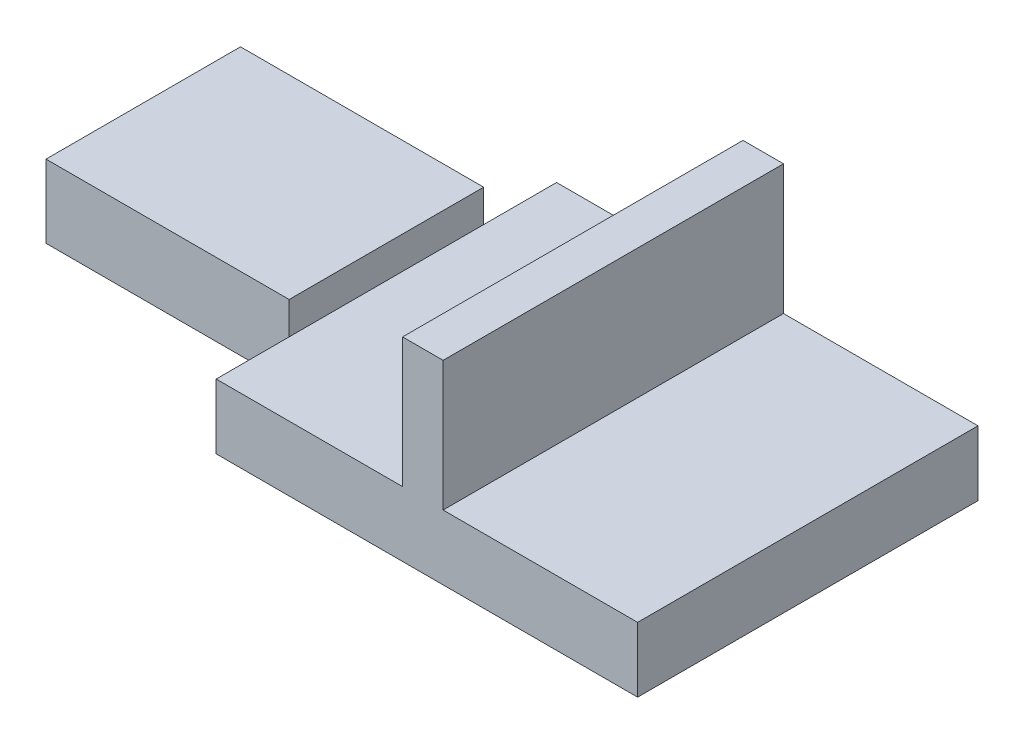
ISO-10303-21;
HEADER;
FILE_DESCRIPTION(('STEP AP214'),'2;1');
FILE_NAME('part.step','',(''),(''),'','','');
FILE_SCHEMA(('AUTOMOTIVE_DESIGN { 1 0 10303 214 1 1 1 1 }'));
ENDSEC;
DATA;
#1=APPLICATION_CONTEXT('core data for automotive mechanical design processes');
#2=APPLICATION_PROTOCOL_DEFINITION('international standard','automotive_design',2000,#1);
#3=PRODUCT_CONTEXT('',#1,'mechanical');
#4=PRODUCT('Part','Part','',(#3));
#5=PRODUCT_RELATED_PRODUCT_CATEGORY('part','',(#4));
#6=PRODUCT_DEFINITION_FORMATION('','',#4);
#7=PRODUCT_DEFINITION_CONTEXT('part definition',#1,'design');
#8=PRODUCT_DEFINITION('design','',#6,#7);
#9=PRODUCT_DEFINITION_SHAPE('','',#8);
#10=(LENGTH_UNIT() NAMED_UNIT(*) SI_UNIT(.MILLI.,.METRE.));
#11=(NAMED_UNIT(*) PLANE_ANGLE_UNIT() SI_UNIT($,.RADIAN.));
#12=(NAMED_UNIT(*) SI_UNIT($,.STERADIAN.) SOLID_ANGLE_UNIT());
#13=UNCERTAINTY_MEASURE_WITH_UNIT(LENGTH_MEASURE(1.E-05),#10,'distance_accuracy_value','');
#14=(GEOMETRIC_REPRESENTATION_CONTEXT(3) GLOBAL_UNCERTAINTY_ASSIGNED_CONTEXT((#13)) GLOBAL_UNIT_ASSIGNED_CONTEXT((#10,
#11,#12)) REPRESENTATION_CONTEXT('',''));
#15=CARTESIAN_POINT('',(0.,0.,0.));
#16=DIRECTION('',(0.,0.,1.));
#17=DIRECTION('',(1.,0.,0.));
#18=AXIS2_PLACEMENT_3D('',#15,#16,#17);
#19=CARTESIAN_POINT('',(-13.,-2.,21.));
#20=DIRECTION('',(1.,0.,0.));
#21=DIRECTION('',(0.,0.,-1.));
#22=AXIS2_PLACEMENT_3D('',#19,#20,#21);
#23=PLANE('',#22);
#24=DIRECTION('',(0.,-1.,0.));
#25=VECTOR('',#24,1.);
#26=CARTESIAN_POINT('',(-13.,-0.5,4.5));
#27=LINE('',#26,#25);
#28=CARTESIAN_POINT('',(-13.,2.,4.50000000000001));
#29=VERTEX_POINT('',#28);
#30=CARTESIAN_POINT('',(-13.,-0.5,4.5));
#31=VERTEX_POINT('',#30);
#32=EDGE_CURVE('E11',#29,#31,#27,.T.);
#33=ORIENTED_EDGE('',*,*,#32,.F.);
#34=DIRECTION('',(0.,0.,-1.));
#35=VECTOR('',#34,1.);
#36=CARTESIAN_POINT('',(-13.,2.,21.));
#37=LINE('',#36,#35);
#38=CARTESIAN_POINT('',(-13.,2.,0.));
#39=VERTEX_POINT('',#38);
#40=EDGE_CURVE('E198',#29,#39,#37,.T.);
#41=ORIENTED_EDGE('',*,*,#40,.T.);
#42=DIRECTION('',(0.,-1.,0.));
#43=VECTOR('',#42,1.);
#44=CARTESIAN_POINT('',(-13.,-2.,0.));
#45=LINE('',#44,#43);
#46=CARTESIAN_POINT('',(-13.,-2.,0.));
#47=VERTEX_POINT('',#46);
#48=EDGE_CURVE('E185',#39,#47,#45,.T.);
#49=ORIENTED_EDGE('',*,*,#48,.T.);
#50=DIRECTION('',(0.,0.,-1.));
#51=VECTOR('',#50,1.);
#52=CARTESIAN_POINT('',(-13.,-2.,21.));
#53=LINE('',#52,#51);
#54=CARTESIAN_POINT('',(-13.,-2.,21.));
#55=VERTEX_POINT('',#54);
#56=EDGE_CURVE('E195',#55,#47,#53,.T.);
#57=ORIENTED_EDGE('',*,*,#56,.F.);
#58=DIRECTION('',(0.,-1.,0.));
#59=VECTOR('',#58,1.);
#60=CARTESIAN_POINT('',(-13.,-2.,21.));
#61=LINE('',#60,#59);
#62=CARTESIAN_POINT('',(-13.,2.,21.));
#63=VERTEX_POINT('',#62);
#64=EDGE_CURVE('E170',#63,#55,#61,.T.);
#65=ORIENTED_EDGE('',*,*,#64,.F.);
#66=CARTESIAN_POINT('',(-13.,2.,16.5));
#67=VERTEX_POINT('',#66);
#68=EDGE_CURVE('E199',#63,#67,#37,.T.);
#69=ORIENTED_EDGE('',*,*,#68,.T.);
#70=DIRECTION('',(0.,1.,0.));
#71=VECTOR('',#70,1.);
#72=CARTESIAN_POINT('',(-13.,-0.5,16.5));
#73=LINE('',#72,#71);
#74=CARTESIAN_POINT('',(-13.,-0.5,16.5));
#75=VERTEX_POINT('',#74);
#76=EDGE_CURVE('E253',#75,#67,#73,.T.);
#77=ORIENTED_EDGE('',*,*,#76,.F.);
#78=DIRECTION('',(0.,0.,1.));
#79=VECTOR('',#78,1.);
#80=CARTESIAN_POINT('',(-13.,-0.5,4.5));
#81=LINE('',#80,#79);
#82=EDGE_CURVE('E50',#31,#75,#81,.T.);
#83=ORIENTED_EDGE('',*,*,#82,.F.);
#84=EDGE_LOOP('',(#33,#41,#49,#57,#65,#69,#77,#83));
#85=FACE_BOUND('',#84,.T.);
#86=ADVANCED_FACE('F33',(#85),#23,.F.);
#87=CARTESIAN_POINT('',(0.999999999999994,2.,21.));
#88=DIRECTION('',(0.,-1.,0.));
#89=DIRECTION('',(0.,0.,-1.));
#90=AXIS2_PLACEMENT_3D('',#87,#88,#89);
#91=PLANE('',#90);
#92=DIRECTION('',(-1.,0.,0.));
#93=VECTOR('',#92,1.);
#94=CARTESIAN_POINT('',(0.999999999999994,2.,0.));
#95=LINE('',#94,#93);
#96=CARTESIAN_POINT('',(13.,2.,0.));
#97=VERTEX_POINT('',#96);
#98=CARTESIAN_POINT('',(0.999999999999994,2.,0.));
#99=VERTEX_POINT('',#98);
#100=EDGE_CURVE('E149',#97,#99,#95,.T.);
#101=ORIENTED_EDGE('',*,*,#100,.T.);
#102=DIRECTION('',(0.,0.,-1.));
#103=VECTOR('',#102,1.);
#104=CARTESIAN_POINT('',(0.999999999999994,2.,21.));
#105=LINE('',#104,#103);
#106=CARTESIAN_POINT('',(0.999999999999994,2.,21.));
#107=VERTEX_POINT('',#106);
#108=EDGE_CURVE('E37',#107,#99,#105,.T.);
#109=ORIENTED_EDGE('',*,*,#108,.F.);
#110=DIRECTION('',(-1.,0.,0.));
#111=VECTOR('',#110,1.);
#112=CARTESIAN_POINT('',(0.999999999999994,2.,21.));
#113=LINE('',#112,#111);
#114=CARTESIAN_POINT('',(13.,2.,21.));
#115=VERTEX_POINT('',#114);
#116=EDGE_CURVE('E158',#115,#107,#113,.T.);
#117=ORIENTED_EDGE('',*,*,#116,.F.);
#118=DIRECTION('',(0.,0.,-1.));
#119=VECTOR('',#118,1.);
#120=CARTESIAN_POINT('',(13.,2.,21.));
#121=LINE('',#120,#119);
#122=EDGE_CURVE('E175',#115,#97,#121,.T.);
#123=ORIENTED_EDGE('',*,*,#122,.T.);
#124=EDGE_LOOP('',(#101,#109,#117,#123));
#125=FACE_BOUND('',#124,.T.);
#126=ADVANCED_FACE('F35',(#125),#91,.F.);
#127=CARTESIAN_POINT('',(0.999999999999994,2.,21.));
#128=DIRECTION('',(-1.,0.,0.));
#129=DIRECTION('',(0.,0.,1.));
#130=AXIS2_PLACEMENT_3D('',#127,#128,#129);
#131=PLANE('',#130);
#132=DIRECTION('',(0.,1.,0.));
#133=VECTOR('',#132,1.);
#134=CARTESIAN_POINT('',(0.999999999999994,2.,0.));
#135=LINE('',#134,#133);
#136=CARTESIAN_POINT('',(0.999999999999994,10.,0.));
#137=VERTEX_POINT('',#136);
#138=EDGE_CURVE('E152',#99,#137,#135,.T.);
#139=ORIENTED_EDGE('',*,*,#138,.T.);
#140=DIRECTION('',(0.,0.,-1.));
#141=VECTOR('',#140,1.);
#142=CARTESIAN_POINT('',(0.999999999999994,10.,21.));
#143=LINE('',#142,#141);
#144=CARTESIAN_POINT('',(0.999999999999994,10.,21.));
#145=VERTEX_POINT('',#144);
#146=EDGE_CURVE('E208',#145,#137,#143,.T.);
#147=ORIENTED_EDGE('',*,*,#146,.F.);
#148=DIRECTION('',(0.,1.,0.));
#149=VECTOR('',#148,1.);
#150=CARTESIAN_POINT('',(0.999999999999994,2.,21.));
#151=LINE('',#150,#149);
#152=EDGE_CURVE('E161',#107,#145,#151,.T.);
#153=ORIENTED_EDGE('',*,*,#152,.F.);
#154=ORIENTED_EDGE('',*,*,#108,.T.);
#155=EDGE_LOOP('',(#139,#147,#153,#154));
#156=FACE_BOUND('',#155,.T.);
#157=ADVANCED_FACE('F217',(#156),#131,.F.);
#158=CARTESIAN_POINT('',(0.999999999999994,10.,21.));
#159=DIRECTION('',(0.,-1.,0.));
#160=DIRECTION('',(0.,0.,-1.));
#161=AXIS2_PLACEMENT_3D('',#158,#159,#160);
#162=PLANE('',#161);
#163=DIRECTION('',(-1.,0.,0.));
#164=VECTOR('',#163,1.);
#165=CARTESIAN_POINT('',(0.999999999999994,10.,0.));
#166=LINE('',#165,#164);
#167=CARTESIAN_POINT('',(-1.50000000000001,10.,0.));
#168=VERTEX_POINT('',#167);
#169=EDGE_CURVE('E178',#137,#168,#166,.T.);
#170=ORIENTED_EDGE('',*,*,#169,.T.);
#171=DIRECTION('',(0.,0.,-1.));
#172=VECTOR('',#171,1.);
#173=CARTESIAN_POINT('',(-1.50000000000001,10.,21.));
#174=LINE('',#173,#172);
#175=CARTESIAN_POINT('',(-1.50000000000001,10.,21.));
#176=VERTEX_POINT('',#175);
#177=EDGE_CURVE('E206',#176,#168,#174,.T.);
#178=ORIENTED_EDGE('',*,*,#177,.F.);
#179=DIRECTION('',(-1.,0.,0.));
#180=VECTOR('',#179,1.);
#181=CARTESIAN_POINT('',(0.999999999999994,10.,21.));
#182=LINE('',#181,#180);
#183=EDGE_CURVE('E164',#145,#176,#182,.T.);
#184=ORIENTED_EDGE('',*,*,#183,.F.);
#185=ORIENTED_EDGE('',*,*,#146,.T.);
#186=EDGE_LOOP('',(#170,#178,#184,#185));
#187=FACE_BOUND('',#186,.T.);
#188=ADVANCED_FACE('F229',(#187),#162,.F.);
#189=CARTESIAN_POINT('',(-1.50000000000001,10.,21.));
#190=DIRECTION('',(1.,0.,0.));
#191=DIRECTION('',(0.,1.,0.));
#192=AXIS2_PLACEMENT_3D('',#189,#190,#191);
#193=PLANE('',#192);
#194=DIRECTION('',(0.,-1.,0.));
#195=VECTOR('',#194,1.);
#196=CARTESIAN_POINT('',(-1.50000000000001,10.,0.));
#197=LINE('',#196,#195);
#198=CARTESIAN_POINT('',(-1.50000000000001,2.,0.));
#199=VERTEX_POINT('',#198);
#200=EDGE_CURVE('E180',#168,#199,#197,.T.);
#201=ORIENTED_EDGE('',*,*,#200,.T.);
#202=DIRECTION('',(0.,0.,-1.));
#203=VECTOR('',#202,1.);
#204=CARTESIAN_POINT('',(-1.50000000000001,2.,21.));
#205=LINE('',#204,#203);
#206=CARTESIAN_POINT('',(-1.50000000000001,2.,21.));
#207=VERTEX_POINT('',#206);
#208=EDGE_CURVE('E202',#207,#199,#205,.T.);
#209=ORIENTED_EDGE('',*,*,#208,.F.);
#210=DIRECTION('',(0.,-1.,0.));
#211=VECTOR('',#210,1.);
#212=CARTESIAN_POINT('',(-1.50000000000001,10.,21.));
#213=LINE('',#212,#211);
#214=EDGE_CURVE('E166',#176,#207,#213,.T.);
#215=ORIENTED_EDGE('',*,*,#214,.F.);
#216=ORIENTED_EDGE('',*,*,#177,.T.);
#217=EDGE_LOOP('',(#201,#209,#215,#216));
#218=FACE_BOUND('',#217,.T.);
#219=ADVANCED_FACE('F232',(#218),#193,.F.);
#220=CARTESIAN_POINT('',(-13.,2.,21.));
#221=DIRECTION('',(0.,-1.,0.));
#222=DIRECTION('',(0.,0.,-1.));
#223=AXIS2_PLACEMENT_3D('',#220,#221,#222);
#224=PLANE('',#223);
#225=DIRECTION('',(-1.,0.,0.));
#226=VECTOR('',#225,1.);
#227=CARTESIAN_POINT('',(-13.,2.,0.));
#228=LINE('',#227,#226);
#229=EDGE_CURVE('E182',#199,#39,#228,.T.);
#230=ORIENTED_EDGE('',*,*,#229,.T.);
#231=ORIENTED_EDGE('',*,*,#40,.F.);
#232=EDGE_CURVE('E203',#67,#29,#37,.T.);
#233=ORIENTED_EDGE('',*,*,#232,.F.);
#234=ORIENTED_EDGE('',*,*,#68,.F.);
#235=DIRECTION('',(-1.,0.,0.));
#236=VECTOR('',#235,1.);
#237=CARTESIAN_POINT('',(-13.,2.,21.));
#238=LINE('',#237,#236);
#239=EDGE_CURVE('E168',#207,#63,#238,.T.);
#240=ORIENTED_EDGE('',*,*,#239,.F.);
#241=ORIENTED_EDGE('',*,*,#208,.T.);
#242=EDGE_LOOP('',(#230,#231,#233,#234,#240,#241));
#243=FACE_BOUND('',#242,.T.);
#244=ADVANCED_FACE('F250',(#243),#224,.F.);
#245=CARTESIAN_POINT('',(-13.,-2.,21.));
#246=DIRECTION('',(0.,1.,0.));
#247=DIRECTION('',(0.,0.,1.));
#248=AXIS2_PLACEMENT_3D('',#245,#246,#247);
#249=PLANE('',#248);
#250=DIRECTION('',(1.,0.,0.));
#251=VECTOR('',#250,1.);
#252=CARTESIAN_POINT('',(-13.,-2.,0.));
#253=LINE('',#252,#251);
#254=CARTESIAN_POINT('',(13.,-2.,0.));
#255=VERTEX_POINT('',#254);
#256=EDGE_CURVE('E187',#47,#255,#253,.T.);
#257=ORIENTED_EDGE('',*,*,#256,.T.);
#258=DIRECTION('',(0.,0.,-1.));
#259=VECTOR('',#258,1.);
#260=CARTESIAN_POINT('',(13.,-2.,21.));
#261=LINE('',#260,#259);
#262=CARTESIAN_POINT('',(13.,-2.,21.));
#263=VERTEX_POINT('',#262);
#264=EDGE_CURVE('E192',#263,#255,#261,.T.);
#265=ORIENTED_EDGE('',*,*,#264,.F.);
#266=DIRECTION('',(1.,0.,0.));
#267=VECTOR('',#266,1.);
#268=CARTESIAN_POINT('',(-13.,-2.,21.));
#269=LINE('',#268,#267);
#270=EDGE_CURVE('E172',#55,#263,#269,.T.);
#271=ORIENTED_EDGE('',*,*,#270,.F.);
#272=ORIENTED_EDGE('',*,*,#56,.T.);
#273=EDGE_LOOP('',(#257,#265,#271,#272));
#274=FACE_BOUND('',#273,.T.);
#275=ADVANCED_FACE('F244',(#274),#249,.F.);
#276=CARTESIAN_POINT('',(13.,-2.,21.));
#277=DIRECTION('',(-1.,0.,0.));
#278=DIRECTION('',(0.,0.,1.));
#279=AXIS2_PLACEMENT_3D('',#276,#277,#278);
#280=PLANE('',#279);
#281=DIRECTION('',(0.,1.,0.));
#282=VECTOR('',#281,1.);
#283=CARTESIAN_POINT('',(13.,-2.,0.));
#284=LINE('',#283,#282);
#285=EDGE_CURVE('E162',#255,#97,#284,.T.);
#286=ORIENTED_EDGE('',*,*,#285,.T.);
#287=ORIENTED_EDGE('',*,*,#122,.F.);
#288=DIRECTION('',(0.,1.,0.));
#289=VECTOR('',#288,1.);
#290=CARTESIAN_POINT('',(13.,-2.,21.));
#291=LINE('',#290,#289);
#292=EDGE_CURVE('E174',#263,#115,#291,.T.);
#293=ORIENTED_EDGE('',*,*,#292,.F.);
#294=ORIENTED_EDGE('',*,*,#264,.T.);
#295=EDGE_LOOP('',(#286,#287,#293,#294));
#296=FACE_BOUND('',#295,.T.);
#297=ADVANCED_FACE('F242',(#296),#280,.F.);
#298=CARTESIAN_POINT('',(0.,0.,21.));
#299=DIRECTION('',(0.,0.,1.));
#300=DIRECTION('',(1.,0.,0.));
#301=AXIS2_PLACEMENT_3D('',#298,#299,#300);
#302=PLANE('',#301);
#303=ORIENTED_EDGE('',*,*,#116,.T.);
#304=ORIENTED_EDGE('',*,*,#152,.T.);
#305=ORIENTED_EDGE('',*,*,#183,.T.);
#306=ORIENTED_EDGE('',*,*,#214,.T.);
#307=ORIENTED_EDGE('',*,*,#239,.T.);
#308=ORIENTED_EDGE('',*,*,#64,.T.);
#309=ORIENTED_EDGE('',*,*,#270,.T.);
#310=ORIENTED_EDGE('',*,*,#292,.T.);
#311=EDGE_LOOP('',(#303,#304,#305,#306,#307,#308,#309,#310));
#312=FACE_BOUND('',#311,.T.);
#313=ADVANCED_FACE('F236',(#312),#302,.T.);
#314=CARTESIAN_POINT('',(0.,0.,0.));
#315=DIRECTION('',(0.,0.,1.));
#316=DIRECTION('',(1.,0.,0.));
#317=AXIS2_PLACEMENT_3D('',#314,#315,#316);
#318=PLANE('',#317);
#319=ORIENTED_EDGE('',*,*,#100,.F.);
#320=ORIENTED_EDGE('',*,*,#285,.F.);
#321=ORIENTED_EDGE('',*,*,#256,.F.);
#322=ORIENTED_EDGE('',*,*,#48,.F.);
#323=ORIENTED_EDGE('',*,*,#229,.F.);
#324=ORIENTED_EDGE('',*,*,#200,.F.);
#325=ORIENTED_EDGE('',*,*,#169,.F.);
#326=ORIENTED_EDGE('',*,*,#138,.F.);
#327=EDGE_LOOP('',(#319,#320,#321,#322,#323,#324,#325,#326));
#328=FACE_BOUND('',#327,.T.);
#329=ADVANCED_FACE('F224',(#328),#318,.F.);
#330=CARTESIAN_POINT('',(-28.,-0.5,4.5));
#331=DIRECTION('',(0.,0.,1.));
#332=DIRECTION('',(1.,0.,0.));
#333=AXIS2_PLACEMENT_3D('',#330,#331,#332);
#334=PLANE('',#333);
#335=CARTESIAN_POINT('',(-13.,4.,4.5));
#336=VERTEX_POINT('',#335);
#337=EDGE_CURVE('E43',#336,#29,#27,.T.);
#338=ORIENTED_EDGE('',*,*,#337,.T.);
#339=ORIENTED_EDGE('',*,*,#32,.T.);
#340=DIRECTION('',(1.,0.,0.));
#341=VECTOR('',#340,1.);
#342=CARTESIAN_POINT('',(-28.,-0.5,4.5));
#343=LINE('',#342,#341);
#344=CARTESIAN_POINT('',(-28.,-0.5,4.5));
#345=VERTEX_POINT('',#344);
#346=EDGE_CURVE('E130',#345,#31,#343,.T.);
#347=ORIENTED_EDGE('',*,*,#346,.F.);
#348=DIRECTION('',(0.,-1.,0.));
#349=VECTOR('',#348,1.);
#350=CARTESIAN_POINT('',(-28.,-0.5,4.5));
#351=LINE('',#350,#349);
#352=CARTESIAN_POINT('',(-28.,4.,4.5));
#353=VERTEX_POINT('',#352);
#354=EDGE_CURVE('E136',#353,#345,#351,.T.);
#355=ORIENTED_EDGE('',*,*,#354,.F.);
#356=DIRECTION('',(1.,0.,0.));
#357=VECTOR('',#356,1.);
#358=CARTESIAN_POINT('',(-28.,4.,4.5));
#359=LINE('',#358,#357);
#360=EDGE_CURVE('E267',#353,#336,#359,.T.);
#361=ORIENTED_EDGE('',*,*,#360,.T.);
#362=EDGE_LOOP('',(#338,#339,#347,#355,#361));
#363=FACE_BOUND('',#362,.T.);
#364=ADVANCED_FACE('F148',(#363),#334,.F.);
#365=CARTESIAN_POINT('',(-28.,-0.5,4.5));
#366=DIRECTION('',(0.,1.,0.));
#367=DIRECTION('',(0.,0.,1.));
#368=AXIS2_PLACEMENT_3D('',#365,#366,#367);
#369=PLANE('',#368);
#370=ORIENTED_EDGE('',*,*,#82,.T.);
#371=DIRECTION('',(1.,0.,0.));
#372=VECTOR('',#371,1.);
#373=CARTESIAN_POINT('',(-28.,-0.5,16.5));
#374=LINE('',#373,#372);
#375=CARTESIAN_POINT('',(-28.,-0.5,16.5));
#376=VERTEX_POINT('',#375);
#377=EDGE_CURVE('E132',#376,#75,#374,.T.);
#378=ORIENTED_EDGE('',*,*,#377,.F.);
#379=DIRECTION('',(0.,0.,1.));
#380=VECTOR('',#379,1.);
#381=CARTESIAN_POINT('',(-28.,-0.5,4.5));
#382=LINE('',#381,#380);
#383=EDGE_CURVE('E126',#345,#376,#382,.T.);
#384=ORIENTED_EDGE('',*,*,#383,.F.);
#385=ORIENTED_EDGE('',*,*,#346,.T.);
#386=EDGE_LOOP('',(#370,#378,#384,#385));
#387=FACE_BOUND('',#386,.T.);
#388=ADVANCED_FACE('F128',(#387),#369,.F.);
#389=CARTESIAN_POINT('',(-28.,-0.5,16.5));
#390=DIRECTION('',(0.,0.,-1.));
#391=DIRECTION('',(-1.,0.,0.));
#392=AXIS2_PLACEMENT_3D('',#389,#390,#391);
#393=PLANE('',#392);
#394=ORIENTED_EDGE('',*,*,#76,.T.);
#395=CARTESIAN_POINT('',(-13.,4.,16.5));
#396=VERTEX_POINT('',#395);
#397=EDGE_CURVE('E256',#67,#396,#73,.T.);
#398=ORIENTED_EDGE('',*,*,#397,.T.);
#399=DIRECTION('',(1.,0.,0.));
#400=VECTOR('',#399,1.);
#401=CARTESIAN_POINT('',(-28.,4.,16.5));
#402=LINE('',#401,#400);
#403=CARTESIAN_POINT('',(-28.,4.,16.5));
#404=VERTEX_POINT('',#403);
#405=EDGE_CURVE('E154',#404,#396,#402,.T.);
#406=ORIENTED_EDGE('',*,*,#405,.F.);
#407=DIRECTION('',(0.,1.,0.));
#408=VECTOR('',#407,1.);
#409=CARTESIAN_POINT('',(-28.,-0.5,16.5));
#410=LINE('',#409,#408);
#411=EDGE_CURVE('E135',#376,#404,#410,.T.);
#412=ORIENTED_EDGE('',*,*,#411,.F.);
#413=ORIENTED_EDGE('',*,*,#377,.T.);
#414=EDGE_LOOP('',(#394,#398,#406,#412,#413));
#415=FACE_BOUND('',#414,.T.);
#416=ADVANCED_FACE('F263',(#415),#393,.F.);
#417=CARTESIAN_POINT('',(-28.,4.,4.5));
#418=DIRECTION('',(0.,-1.,0.));
#419=DIRECTION('',(0.,0.,-1.));
#420=AXIS2_PLACEMENT_3D('',#417,#418,#419);
#421=PLANE('',#420);
#422=DIRECTION('',(0.,0.,-1.));
#423=VECTOR('',#422,1.);
#424=CARTESIAN_POINT('',(-13.,4.,4.5));
#425=LINE('',#424,#423);
#426=EDGE_CURVE('E145',#396,#336,#425,.T.);
#427=ORIENTED_EDGE('',*,*,#426,.T.);
#428=ORIENTED_EDGE('',*,*,#360,.F.);
#429=DIRECTION('',(0.,0.,-1.));
#430=VECTOR('',#429,1.);
#431=CARTESIAN_POINT('',(-28.,4.,4.5));
#432=LINE('',#431,#430);
#433=EDGE_CURVE('E141',#404,#353,#432,.T.);
#434=ORIENTED_EDGE('',*,*,#433,.F.);
#435=ORIENTED_EDGE('',*,*,#405,.T.);
#436=EDGE_LOOP('',(#427,#428,#434,#435));
#437=FACE_BOUND('',#436,.T.);
#438=ADVANCED_FACE('F269',(#437),#421,.F.);
#439=CARTESIAN_POINT('',(-28.,0.,0.));
#440=DIRECTION('',(1.,0.,0.));
#441=DIRECTION('',(0.,0.,-1.));
#442=AXIS2_PLACEMENT_3D('',#439,#440,#441);
#443=PLANE('',#442);
#444=ORIENTED_EDGE('',*,*,#354,.T.);
#445=ORIENTED_EDGE('',*,*,#383,.T.);
#446=ORIENTED_EDGE('',*,*,#411,.T.);
#447=ORIENTED_EDGE('',*,*,#433,.T.);
#448=EDGE_LOOP('',(#444,#445,#446,#447));
#449=FACE_BOUND('',#448,.T.);
#450=ADVANCED_FACE('F139',(#449),#443,.F.);
#451=CARTESIAN_POINT('',(-13.,0.,0.));
#452=DIRECTION('',(1.,0.,0.));
#453=DIRECTION('',(0.,0.,-1.));
#454=AXIS2_PLACEMENT_3D('',#451,#452,#453);
#455=PLANE('',#454);
#456=ORIENTED_EDGE('',*,*,#397,.F.);
#457=ORIENTED_EDGE('',*,*,#232,.T.);
#458=ORIENTED_EDGE('',*,*,#337,.F.);
#459=ORIENTED_EDGE('',*,*,#426,.F.);
#460=EDGE_LOOP('',(#456,#457,#458,#459));
#461=FACE_BOUND('',#460,.T.);
#462=ADVANCED_FACE('F257',(#461),#455,.T.);
#463=CLOSED_SHELL('',(#86,#126,#157,#188,#219,#244,#275,#297,#313,#329,#364,#388,#416,#438,#450,#462));
#464=MANIFOLD_SOLID_BREP('B2',#463);
#465=ADVANCED_BREP_SHAPE_REPRESENTATION('',(#18,#464),#14);
#466=SHAPE_DEFINITION_REPRESENTATION(#9,#465);
ENDSEC;
END-ISO-10303-21;
